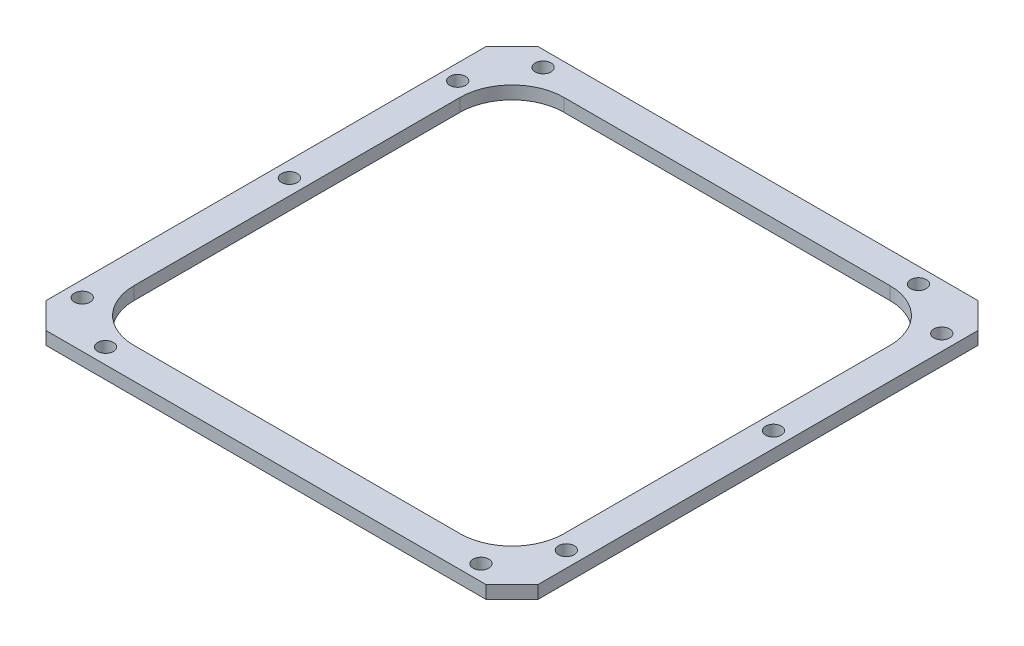
ISO-10303-21;
HEADER;
FILE_DESCRIPTION(('STEP AP214'),'2;1');
FILE_NAME('part.step','',(''),(''),'','','');
FILE_SCHEMA(('AUTOMOTIVE_DESIGN { 1 0 10303 214 1 1 1 1 }'));
ENDSEC;
DATA;
#1=APPLICATION_CONTEXT('core data for automotive mechanical design processes');
#2=APPLICATION_PROTOCOL_DEFINITION('international standard','automotive_design',2000,#1);
#3=PRODUCT_CONTEXT('',#1,'mechanical');
#4=PRODUCT('Part','Part','',(#3));
#5=PRODUCT_RELATED_PRODUCT_CATEGORY('part','',(#4));
#6=PRODUCT_DEFINITION_FORMATION('','',#4);
#7=PRODUCT_DEFINITION_CONTEXT('part definition',#1,'design');
#8=PRODUCT_DEFINITION('design','',#6,#7);
#9=PRODUCT_DEFINITION_SHAPE('','',#8);
#10=(LENGTH_UNIT() NAMED_UNIT(*) SI_UNIT(.MILLI.,.METRE.));
#11=(NAMED_UNIT(*) PLANE_ANGLE_UNIT() SI_UNIT($,.RADIAN.));
#12=(NAMED_UNIT(*) SI_UNIT($,.STERADIAN.) SOLID_ANGLE_UNIT());
#13=UNCERTAINTY_MEASURE_WITH_UNIT(LENGTH_MEASURE(1.E-05),#10,'distance_accuracy_value','');
#14=(GEOMETRIC_REPRESENTATION_CONTEXT(3) GLOBAL_UNCERTAINTY_ASSIGNED_CONTEXT((#13)) GLOBAL_UNIT_ASSIGNED_CONTEXT((#10,
#11,#12)) REPRESENTATION_CONTEXT('',''));
#15=CARTESIAN_POINT('',(0.,0.,0.));
#16=DIRECTION('',(0.,0.,1.));
#17=DIRECTION('',(1.,0.,0.));
#18=AXIS2_PLACEMENT_3D('',#15,#16,#17);
#19=CARTESIAN_POINT('',(-95.,5.,-95.));
#20=DIRECTION('',(0.,0.,-1.));
#21=DIRECTION('',(-1.,0.,0.));
#22=AXIS2_PLACEMENT_3D('',#19,#20,#21);
#23=PLANE('',#22);
#24=DIRECTION('',(1.,0.,0.));
#25=VECTOR('',#24,1.);
#26=CARTESIAN_POINT('',(-95.,5.,-95.));
#27=LINE('',#26,#25);
#28=CARTESIAN_POINT('',(-85.,5.,-95.));
#29=VERTEX_POINT('',#28);
#30=CARTESIAN_POINT('',(85.,5.,-95.));
#31=VERTEX_POINT('',#30);
#32=EDGE_CURVE('E190',#29,#31,#27,.T.);
#33=ORIENTED_EDGE('',*,*,#32,.T.);
#34=DIRECTION('',(0.,-1.,0.));
#35=VECTOR('',#34,1.);
#36=CARTESIAN_POINT('',(85.,5.,-95.));
#37=LINE('',#36,#35);
#38=CARTESIAN_POINT('',(85.,0.,-95.));
#39=VERTEX_POINT('',#38);
#40=EDGE_CURVE('E246',#31,#39,#37,.T.);
#41=ORIENTED_EDGE('',*,*,#40,.T.);
#42=DIRECTION('',(1.,0.,0.));
#43=VECTOR('',#42,1.);
#44=CARTESIAN_POINT('',(-95.,0.,-95.));
#45=LINE('',#44,#43);
#46=CARTESIAN_POINT('',(-85.,0.,-95.));
#47=VERTEX_POINT('',#46);
#48=EDGE_CURVE('E201',#47,#39,#45,.T.);
#49=ORIENTED_EDGE('',*,*,#48,.F.);
#50=DIRECTION('',(0.,1.,0.));
#51=VECTOR('',#50,1.);
#52=CARTESIAN_POINT('',(-85.,5.,-95.));
#53=LINE('',#52,#51);
#54=EDGE_CURVE('E236',#47,#29,#53,.T.);
#55=ORIENTED_EDGE('',*,*,#54,.T.);
#56=EDGE_LOOP('',(#33,#41,#49,#55));
#57=FACE_BOUND('',#56,.T.);
#58=ADVANCED_FACE('F32',(#57),#23,.T.);
#59=CARTESIAN_POINT('',(-95.,5.,-95.));
#60=DIRECTION('',(1.,0.,0.));
#61=DIRECTION('',(0.,0.,-1.));
#62=AXIS2_PLACEMENT_3D('',#59,#60,#61);
#63=PLANE('',#62);
#64=DIRECTION('',(0.,0.,1.));
#65=VECTOR('',#64,1.);
#66=CARTESIAN_POINT('',(-95.,5.,-95.));
#67=LINE('',#66,#65);
#68=CARTESIAN_POINT('',(-95.,5.,-85.));
#69=VERTEX_POINT('',#68);
#70=CARTESIAN_POINT('',(-95.,5.,85.));
#71=VERTEX_POINT('',#70);
#72=EDGE_CURVE('E199',#69,#71,#67,.T.);
#73=ORIENTED_EDGE('',*,*,#72,.F.);
#74=DIRECTION('',(0.,-1.,0.));
#75=VECTOR('',#74,1.);
#76=CARTESIAN_POINT('',(-95.,0.,-85.));
#77=LINE('',#76,#75);
#78=CARTESIAN_POINT('',(-95.,0.,-85.));
#79=VERTEX_POINT('',#78);
#80=EDGE_CURVE('E271',#69,#79,#77,.T.);
#81=ORIENTED_EDGE('',*,*,#80,.T.);
#82=DIRECTION('',(0.,0.,1.));
#83=VECTOR('',#82,1.);
#84=CARTESIAN_POINT('',(-95.,0.,-95.));
#85=LINE('',#84,#83);
#86=CARTESIAN_POINT('',(-95.,0.,85.));
#87=VERTEX_POINT('',#86);
#88=EDGE_CURVE('E194',#79,#87,#85,.T.);
#89=ORIENTED_EDGE('',*,*,#88,.T.);
#90=DIRECTION('',(0.,1.,0.));
#91=VECTOR('',#90,1.);
#92=CARTESIAN_POINT('',(-95.,5.,85.));
#93=LINE('',#92,#91);
#94=EDGE_CURVE('E269',#87,#71,#93,.T.);
#95=ORIENTED_EDGE('',*,*,#94,.T.);
#96=EDGE_LOOP('',(#73,#81,#89,#95));
#97=FACE_BOUND('',#96,.T.);
#98=ADVANCED_FACE('F277',(#97),#63,.F.);
#99=CARTESIAN_POINT('',(-95.,5.,95.));
#100=DIRECTION('',(0.,0.,-1.));
#101=DIRECTION('',(-1.,0.,0.));
#102=AXIS2_PLACEMENT_3D('',#99,#100,#101);
#103=PLANE('',#102);
#104=DIRECTION('',(1.,0.,0.));
#105=VECTOR('',#104,1.);
#106=CARTESIAN_POINT('',(-95.,5.,95.));
#107=LINE('',#106,#105);
#108=CARTESIAN_POINT('',(-85.,5.,95.));
#109=VERTEX_POINT('',#108);
#110=CARTESIAN_POINT('',(85.,5.,95.));
#111=VERTEX_POINT('',#110);
#112=EDGE_CURVE('E197',#109,#111,#107,.T.);
#113=ORIENTED_EDGE('',*,*,#112,.F.);
#114=DIRECTION('',(0.,-1.,0.));
#115=VECTOR('',#114,1.);
#116=CARTESIAN_POINT('',(-85.,5.,95.));
#117=LINE('',#116,#115);
#118=CARTESIAN_POINT('',(-85.,0.,95.));
#119=VERTEX_POINT('',#118);
#120=EDGE_CURVE('E11',#109,#119,#117,.T.);
#121=ORIENTED_EDGE('',*,*,#120,.T.);
#122=DIRECTION('',(1.,0.,0.));
#123=VECTOR('',#122,1.);
#124=CARTESIAN_POINT('',(-95.,0.,95.));
#125=LINE('',#124,#123);
#126=CARTESIAN_POINT('',(85.,0.,95.));
#127=VERTEX_POINT('',#126);
#128=EDGE_CURVE('E207',#119,#127,#125,.T.);
#129=ORIENTED_EDGE('',*,*,#128,.T.);
#130=DIRECTION('',(0.,1.,0.));
#131=VECTOR('',#130,1.);
#132=CARTESIAN_POINT('',(85.,5.,95.));
#133=LINE('',#132,#131);
#134=EDGE_CURVE('E40',#127,#111,#133,.T.);
#135=ORIENTED_EDGE('',*,*,#134,.T.);
#136=EDGE_LOOP('',(#113,#121,#129,#135));
#137=FACE_BOUND('',#136,.T.);
#138=ADVANCED_FACE('F288',(#137),#103,.F.);
#139=CARTESIAN_POINT('',(95.,5.,-95.));
#140=DIRECTION('',(1.,0.,0.));
#141=DIRECTION('',(0.,0.,-1.));
#142=AXIS2_PLACEMENT_3D('',#139,#140,#141);
#143=PLANE('',#142);
#144=DIRECTION('',(0.,0.,1.));
#145=VECTOR('',#144,1.);
#146=CARTESIAN_POINT('',(95.,0.,-95.));
#147=LINE('',#146,#145);
#148=CARTESIAN_POINT('',(95.,0.,-85.));
#149=VERTEX_POINT('',#148);
#150=CARTESIAN_POINT('',(95.,0.,85.));
#151=VERTEX_POINT('',#150);
#152=EDGE_CURVE('E204',#149,#151,#147,.T.);
#153=ORIENTED_EDGE('',*,*,#152,.F.);
#154=DIRECTION('',(0.,1.,0.));
#155=VECTOR('',#154,1.);
#156=CARTESIAN_POINT('',(95.,5.,-85.));
#157=LINE('',#156,#155);
#158=CARTESIAN_POINT('',(95.,5.,-85.));
#159=VERTEX_POINT('',#158);
#160=EDGE_CURVE('E260',#149,#159,#157,.T.);
#161=ORIENTED_EDGE('',*,*,#160,.T.);
#162=DIRECTION('',(0.,0.,1.));
#163=VECTOR('',#162,1.);
#164=CARTESIAN_POINT('',(95.,5.,-95.));
#165=LINE('',#164,#163);
#166=CARTESIAN_POINT('',(95.,5.,85.));
#167=VERTEX_POINT('',#166);
#168=EDGE_CURVE('E193',#159,#167,#165,.T.);
#169=ORIENTED_EDGE('',*,*,#168,.T.);
#170=DIRECTION('',(0.,-1.,0.));
#171=VECTOR('',#170,1.);
#172=CARTESIAN_POINT('',(95.,0.,85.));
#173=LINE('',#172,#171);
#174=EDGE_CURVE('E257',#167,#151,#173,.T.);
#175=ORIENTED_EDGE('',*,*,#174,.T.);
#176=EDGE_LOOP('',(#153,#161,#169,#175));
#177=FACE_BOUND('',#176,.T.);
#178=ADVANCED_FACE('F295',(#177),#143,.T.);
#179=CARTESIAN_POINT('',(0.,5.,0.));
#180=DIRECTION('',(0.,-1.,0.));
#181=DIRECTION('',(0.,0.,-1.));
#182=AXIS2_PLACEMENT_3D('',#179,#180,#181);
#183=PLANE('',#182);
#184=CARTESIAN_POINT('',(-89.,5.,-3.));
#185=DIRECTION('',(0.,1.,0.));
#186=DIRECTION('',(0.,0.,1.));
#187=AXIS2_PLACEMENT_3D('',#184,#185,#186);
#188=CIRCLE('',#187,3.04999999999999);
#189=CARTESIAN_POINT('',(-89.,5.,0.0499999999999884));
#190=VERTEX_POINT('',#189);
#191=EDGE_CURVE('E241',#190,#190,#188,.T.);
#192=ORIENTED_EDGE('',*,*,#191,.F.);
#193=EDGE_LOOP('',(#192));
#194=FACE_BOUND('',#193,.T.);
#195=CARTESIAN_POINT('',(89.,5.,-12.));
#196=DIRECTION('',(0.,1.,0.));
#197=DIRECTION('',(0.,0.,1.));
#198=AXIS2_PLACEMENT_3D('',#195,#196,#197);
#199=CIRCLE('',#198,3.04999999999999);
#200=CARTESIAN_POINT('',(89.,5.,-8.95000000000001));
#201=VERTEX_POINT('',#200);
#202=EDGE_CURVE('E401',#201,#201,#199,.T.);
#203=ORIENTED_EDGE('',*,*,#202,.F.);
#204=EDGE_LOOP('',(#203));
#205=FACE_BOUND('',#204,.T.);
#206=CARTESIAN_POINT('',(77.0000000000146,5.,88.9999999999822));
#207=DIRECTION('',(0.,1.,0.));
#208=DIRECTION('',(0.,0.,1.));
#209=AXIS2_PLACEMENT_3D('',#206,#207,#208);
#210=CIRCLE('',#209,3.04999999999999);
#211=CARTESIAN_POINT('',(77.0000000000146,5.,92.0499999999822));
#212=VERTEX_POINT('',#211);
#213=EDGE_CURVE('E373',#212,#212,#210,.T.);
#214=ORIENTED_EDGE('',*,*,#213,.F.);
#215=EDGE_LOOP('',(#214));
#216=FACE_BOUND('',#215,.T.);
#217=CARTESIAN_POINT('',(67.9999999999984,5.,-89.0000000000162));
#218=DIRECTION('',(0.,1.,0.));
#219=DIRECTION('',(0.,0.,1.));
#220=AXIS2_PLACEMENT_3D('',#217,#218,#219);
#221=CIRCLE('',#220,3.04999999999999);
#222=CARTESIAN_POINT('',(67.9999999999984,5.,-85.9500000000162));
#223=VERTEX_POINT('',#222);
#224=EDGE_CURVE('E380',#223,#223,#221,.T.);
#225=ORIENTED_EDGE('',*,*,#224,.F.);
#226=EDGE_LOOP('',(#225));
#227=FACE_BOUND('',#226,.T.);
#228=CARTESIAN_POINT('',(88.9999999999984,5.,-77.0000000000162));
#229=DIRECTION('',(0.,1.,0.));
#230=DIRECTION('',(0.,0.,1.));
#231=AXIS2_PLACEMENT_3D('',#228,#229,#230);
#232=CIRCLE('',#231,3.04999999999999);
#233=CARTESIAN_POINT('',(88.9999999999984,5.,-73.9500000000162));
#234=VERTEX_POINT('',#233);
#235=EDGE_CURVE('E361',#234,#234,#232,.T.);
#236=ORIENTED_EDGE('',*,*,#235,.F.);
#237=EDGE_LOOP('',(#236));
#238=FACE_BOUND('',#237,.T.);
#239=CARTESIAN_POINT('',(-89.,5.,-68.));
#240=DIRECTION('',(0.,1.,0.));
#241=DIRECTION('',(0.,0.,1.));
#242=AXIS2_PLACEMENT_3D('',#239,#240,#241);
#243=CIRCLE('',#242,3.04999999999999);
#244=CARTESIAN_POINT('',(-89.,5.,-64.95));
#245=VERTEX_POINT('',#244);
#246=EDGE_CURVE('E368',#245,#245,#243,.T.);
#247=ORIENTED_EDGE('',*,*,#246,.F.);
#248=EDGE_LOOP('',(#247));
#249=FACE_BOUND('',#248,.T.);
#250=CARTESIAN_POINT('',(89.0000000000146,5.,67.9999999999822));
#251=DIRECTION('',(0.,1.,0.));
#252=DIRECTION('',(0.,0.,1.));
#253=AXIS2_PLACEMENT_3D('',#250,#251,#252);
#254=CIRCLE('',#253,3.04999999999999);
#255=CARTESIAN_POINT('',(89.0000000000146,5.,71.0499999999822));
#256=VERTEX_POINT('',#255);
#257=EDGE_CURVE('E396',#256,#256,#254,.T.);
#258=ORIENTED_EDGE('',*,*,#257,.F.);
#259=EDGE_LOOP('',(#258));
#260=FACE_BOUND('',#259,.T.);
#261=CARTESIAN_POINT('',(-88.9999999999838,5.,76.9999999999984));
#262=DIRECTION('',(0.,1.,0.));
#263=DIRECTION('',(0.,0.,1.));
#264=AXIS2_PLACEMENT_3D('',#261,#262,#263);
#265=CIRCLE('',#264,3.04999999999999);
#266=CARTESIAN_POINT('',(-88.9999999999838,5.,80.0499999999984));
#267=VERTEX_POINT('',#266);
#268=EDGE_CURVE('E390',#267,#267,#265,.T.);
#269=ORIENTED_EDGE('',*,*,#268,.F.);
#270=EDGE_LOOP('',(#269));
#271=FACE_BOUND('',#270,.T.);
#272=CARTESIAN_POINT('',(-67.9999999999838,5.,88.9999999999984));
#273=DIRECTION('',(0.,1.,0.));
#274=DIRECTION('',(0.,0.,1.));
#275=AXIS2_PLACEMENT_3D('',#272,#273,#274);
#276=CIRCLE('',#275,3.04999999999999);
#277=CARTESIAN_POINT('',(-67.9999999999838,5.,92.0499999999984));
#278=VERTEX_POINT('',#277);
#279=EDGE_CURVE('E244',#278,#278,#276,.T.);
#280=ORIENTED_EDGE('',*,*,#279,.F.);
#281=EDGE_LOOP('',(#280));
#282=FACE_BOUND('',#281,.T.);
#283=CARTESIAN_POINT('',(-77.,5.,-89.));
#284=DIRECTION('',(0.,1.,0.));
#285=DIRECTION('',(0.,0.,1.));
#286=AXIS2_PLACEMENT_3D('',#283,#284,#285);
#287=CIRCLE('',#286,3.04999999999999);
#288=CARTESIAN_POINT('',(-77.,5.,-85.95));
#289=VERTEX_POINT('',#288);
#290=EDGE_CURVE('E180',#289,#289,#287,.T.);
#291=ORIENTED_EDGE('',*,*,#290,.F.);
#292=EDGE_LOOP('',(#291));
#293=FACE_BOUND('',#292,.T.);
#294=DIRECTION('',(-1.,0.,0.));
#295=VECTOR('',#294,1.);
#296=CARTESIAN_POINT('',(-83.,5.,-83.));
#297=LINE('',#296,#295);
#298=CARTESIAN_POINT('',(62.9999999999999,5.,-83.));
#299=VERTEX_POINT('',#298);
#300=CARTESIAN_POINT('',(-63.,5.,-83.));
#301=VERTEX_POINT('',#300);
#302=EDGE_CURVE('E173',#299,#301,#297,.T.);
#303=ORIENTED_EDGE('',*,*,#302,.F.);
#304=CARTESIAN_POINT('',(63.,5.,-63.));
#305=DIRECTION('',(0.,-1.,0.));
#306=DIRECTION('',(0.,0.,-1.));
#307=AXIS2_PLACEMENT_3D('',#304,#305,#306);
#308=CIRCLE('',#307,20.);
#309=CARTESIAN_POINT('',(83.,5.,-63.));
#310=VERTEX_POINT('',#309);
#311=EDGE_CURVE('E172',#299,#310,#308,.T.);
#312=ORIENTED_EDGE('',*,*,#311,.T.);
#313=DIRECTION('',(0.,0.,-1.));
#314=VECTOR('',#313,1.);
#315=CARTESIAN_POINT('',(83.,5.,-83.));
#316=LINE('',#315,#314);
#317=CARTESIAN_POINT('',(83.,5.,63.));
#318=VERTEX_POINT('',#317);
#319=EDGE_CURVE('E163',#318,#310,#316,.T.);
#320=ORIENTED_EDGE('',*,*,#319,.F.);
#321=CARTESIAN_POINT('',(63.,5.,63.));
#322=DIRECTION('',(0.,-1.,0.));
#323=DIRECTION('',(0.,0.,-1.));
#324=AXIS2_PLACEMENT_3D('',#321,#322,#323);
#325=CIRCLE('',#324,20.);
#326=CARTESIAN_POINT('',(62.9999999999999,5.,83.));
#327=VERTEX_POINT('',#326);
#328=EDGE_CURVE('E146',#318,#327,#325,.T.);
#329=ORIENTED_EDGE('',*,*,#328,.T.);
#330=DIRECTION('',(1.,0.,0.));
#331=VECTOR('',#330,1.);
#332=CARTESIAN_POINT('',(-83.,5.,83.));
#333=LINE('',#332,#331);
#334=CARTESIAN_POINT('',(-63.,5.,83.));
#335=VERTEX_POINT('',#334);
#336=EDGE_CURVE('E188',#335,#327,#333,.T.);
#337=ORIENTED_EDGE('',*,*,#336,.F.);
#338=CARTESIAN_POINT('',(-63.,5.,63.));
#339=DIRECTION('',(0.,-1.,0.));
#340=DIRECTION('',(0.,0.,-1.));
#341=AXIS2_PLACEMENT_3D('',#338,#339,#340);
#342=CIRCLE('',#341,20.);
#343=CARTESIAN_POINT('',(-83.,5.,63.));
#344=VERTEX_POINT('',#343);
#345=EDGE_CURVE('E225',#335,#344,#342,.T.);
#346=ORIENTED_EDGE('',*,*,#345,.T.);
#347=DIRECTION('',(0.,0.,1.));
#348=VECTOR('',#347,1.);
#349=CARTESIAN_POINT('',(-83.,5.,-83.));
#350=LINE('',#349,#348);
#351=CARTESIAN_POINT('',(-83.,5.,-63.));
#352=VERTEX_POINT('',#351);
#353=EDGE_CURVE('E177',#352,#344,#350,.T.);
#354=ORIENTED_EDGE('',*,*,#353,.F.);
#355=CARTESIAN_POINT('',(-63.,5.,-63.));
#356=DIRECTION('',(0.,-1.,0.));
#357=DIRECTION('',(0.,0.,-1.));
#358=AXIS2_PLACEMENT_3D('',#355,#356,#357);
#359=CIRCLE('',#358,20.);
#360=EDGE_CURVE('E229',#352,#301,#359,.T.);
#361=ORIENTED_EDGE('',*,*,#360,.T.);
#362=EDGE_LOOP('',(#303,#312,#320,#329,#337,#346,#354,#361));
#363=FACE_BOUND('',#362,.T.);
#364=ORIENTED_EDGE('',*,*,#168,.F.);
#365=DIRECTION('',(0.707106781186548,0.,0.707106781186548));
#366=VECTOR('',#365,1.);
#367=CARTESIAN_POINT('',(85.,5.,-95.));
#368=LINE('',#367,#366);
#369=EDGE_CURVE('E267',#159,#31,#368,.F.);
#370=ORIENTED_EDGE('',*,*,#369,.T.);
#371=ORIENTED_EDGE('',*,*,#32,.F.);
#372=DIRECTION('',(-0.70710678118655,0.,0.707106781186546));
#373=VECTOR('',#372,1.);
#374=CARTESIAN_POINT('',(-95.,5.,-85.));
#375=LINE('',#374,#373);
#376=EDGE_CURVE('E265',#29,#69,#375,.T.);
#377=ORIENTED_EDGE('',*,*,#376,.T.);
#378=ORIENTED_EDGE('',*,*,#72,.T.);
#379=DIRECTION('',(-0.707106781186548,0.,-0.707106781186548));
#380=VECTOR('',#379,1.);
#381=CARTESIAN_POINT('',(-85.,5.,95.));
#382=LINE('',#381,#380);
#383=EDGE_CURVE('E53',#71,#109,#382,.F.);
#384=ORIENTED_EDGE('',*,*,#383,.T.);
#385=ORIENTED_EDGE('',*,*,#112,.T.);
#386=DIRECTION('',(0.70710678118655,0.,-0.707106781186545));
#387=VECTOR('',#386,1.);
#388=CARTESIAN_POINT('',(95.,5.,85.));
#389=LINE('',#388,#387);
#390=EDGE_CURVE('E262',#111,#167,#389,.T.);
#391=ORIENTED_EDGE('',*,*,#390,.T.);
#392=EDGE_LOOP('',(#364,#370,#371,#377,#378,#384,#385,#391));
#393=FACE_BOUND('',#392,.T.);
#394=ADVANCED_FACE('F171',(#194,#205,#216,#227,#238,#249,#260,#271,#282,#293,#363,#393),#183,.F.);
#395=CARTESIAN_POINT('',(0.,0.,0.));
#396=DIRECTION('',(0.,-1.,0.));
#397=DIRECTION('',(0.,0.,-1.));
#398=AXIS2_PLACEMENT_3D('',#395,#396,#397);
#399=PLANE('',#398);
#400=CARTESIAN_POINT('',(-89.,0.,-3.));
#401=DIRECTION('',(0.,-1.,0.));
#402=DIRECTION('',(0.,0.,-1.));
#403=AXIS2_PLACEMENT_3D('',#400,#401,#402);
#404=CIRCLE('',#403,3.04999999999999);
#405=CARTESIAN_POINT('',(-89.,0.,-6.04999999999999));
#406=VERTEX_POINT('',#405);
#407=EDGE_CURVE('E240',#406,#406,#404,.T.);
#408=ORIENTED_EDGE('',*,*,#407,.F.);
#409=EDGE_LOOP('',(#408));
#410=FACE_BOUND('',#409,.T.);
#411=CARTESIAN_POINT('',(89.,0.,-12.));
#412=DIRECTION('',(0.,-1.,0.));
#413=DIRECTION('',(0.,0.,-1.));
#414=AXIS2_PLACEMENT_3D('',#411,#412,#413);
#415=CIRCLE('',#414,3.04999999999999);
#416=CARTESIAN_POINT('',(89.,0.,-15.05));
#417=VERTEX_POINT('',#416);
#418=EDGE_CURVE('E237',#417,#417,#415,.T.);
#419=ORIENTED_EDGE('',*,*,#418,.F.);
#420=EDGE_LOOP('',(#419));
#421=FACE_BOUND('',#420,.T.);
#422=CARTESIAN_POINT('',(77.0000000000146,0.,88.9999999999822));
#423=DIRECTION('',(0.,1.,0.));
#424=DIRECTION('',(0.,0.,1.));
#425=AXIS2_PLACEMENT_3D('',#422,#423,#424);
#426=CIRCLE('',#425,3.04999999999999);
#427=CARTESIAN_POINT('',(77.0000000000146,0.,92.0499999999822));
#428=VERTEX_POINT('',#427);
#429=EDGE_CURVE('E376',#428,#428,#426,.T.);
#430=ORIENTED_EDGE('',*,*,#429,.T.);
#431=EDGE_LOOP('',(#430));
#432=FACE_BOUND('',#431,.T.);
#433=CARTESIAN_POINT('',(67.9999999999984,0.,-89.0000000000162));
#434=DIRECTION('',(0.,1.,0.));
#435=DIRECTION('',(0.,0.,1.));
#436=AXIS2_PLACEMENT_3D('',#433,#434,#435);
#437=CIRCLE('',#436,3.04999999999999);
#438=CARTESIAN_POINT('',(67.9999999999984,0.,-85.9500000000162));
#439=VERTEX_POINT('',#438);
#440=EDGE_CURVE('E365',#439,#439,#437,.T.);
#441=ORIENTED_EDGE('',*,*,#440,.T.);
#442=EDGE_LOOP('',(#441));
#443=FACE_BOUND('',#442,.T.);
#444=CARTESIAN_POINT('',(88.9999999999984,0.,-77.0000000000162));
#445=DIRECTION('',(0.,1.,0.));
#446=DIRECTION('',(0.,0.,1.));
#447=AXIS2_PLACEMENT_3D('',#444,#445,#446);
#448=CIRCLE('',#447,3.04999999999999);
#449=CARTESIAN_POINT('',(88.9999999999984,0.,-73.9500000000162));
#450=VERTEX_POINT('',#449);
#451=EDGE_CURVE('E364',#450,#450,#448,.T.);
#452=ORIENTED_EDGE('',*,*,#451,.T.);
#453=EDGE_LOOP('',(#452));
#454=FACE_BOUND('',#453,.T.);
#455=CARTESIAN_POINT('',(-89.,0.,-68.));
#456=DIRECTION('',(0.,1.,0.));
#457=DIRECTION('',(0.,0.,1.));
#458=AXIS2_PLACEMENT_3D('',#455,#456,#457);
#459=CIRCLE('',#458,3.04999999999999);
#460=CARTESIAN_POINT('',(-89.,0.,-64.95));
#461=VERTEX_POINT('',#460);
#462=EDGE_CURVE('E359',#461,#461,#459,.T.);
#463=ORIENTED_EDGE('',*,*,#462,.T.);
#464=EDGE_LOOP('',(#463));
#465=FACE_BOUND('',#464,.T.);
#466=CARTESIAN_POINT('',(89.0000000000146,0.,67.9999999999822));
#467=DIRECTION('',(0.,1.,0.));
#468=DIRECTION('',(0.,0.,1.));
#469=AXIS2_PLACEMENT_3D('',#466,#467,#468);
#470=CIRCLE('',#469,3.04999999999999);
#471=CARTESIAN_POINT('',(89.0000000000146,0.,71.0499999999822));
#472=VERTEX_POINT('',#471);
#473=EDGE_CURVE('E377',#472,#472,#470,.T.);
#474=ORIENTED_EDGE('',*,*,#473,.T.);
#475=EDGE_LOOP('',(#474));
#476=FACE_BOUND('',#475,.T.);
#477=CARTESIAN_POINT('',(-88.9999999999838,0.,76.9999999999984));
#478=DIRECTION('',(0.,1.,0.));
#479=DIRECTION('',(0.,0.,1.));
#480=AXIS2_PLACEMENT_3D('',#477,#478,#479);
#481=CIRCLE('',#480,3.04999999999999);
#482=CARTESIAN_POINT('',(-88.9999999999838,0.,80.0499999999984));
#483=VERTEX_POINT('',#482);
#484=EDGE_CURVE('E393',#483,#483,#481,.T.);
#485=ORIENTED_EDGE('',*,*,#484,.T.);
#486=EDGE_LOOP('',(#485));
#487=FACE_BOUND('',#486,.T.);
#488=CARTESIAN_POINT('',(-67.9999999999838,0.,88.9999999999984));
#489=DIRECTION('',(0.,1.,0.));
#490=DIRECTION('',(0.,0.,1.));
#491=AXIS2_PLACEMENT_3D('',#488,#489,#490);
#492=CIRCLE('',#491,3.04999999999999);
#493=CARTESIAN_POINT('',(-67.9999999999838,0.,92.0499999999984));
#494=VERTEX_POINT('',#493);
#495=EDGE_CURVE('E387',#494,#494,#492,.T.);
#496=ORIENTED_EDGE('',*,*,#495,.T.);
#497=EDGE_LOOP('',(#496));
#498=FACE_BOUND('',#497,.T.);
#499=CARTESIAN_POINT('',(-77.,0.,-89.));
#500=DIRECTION('',(0.,1.,0.));
#501=DIRECTION('',(0.,0.,1.));
#502=AXIS2_PLACEMENT_3D('',#499,#500,#501);
#503=CIRCLE('',#502,3.04999999999999);
#504=CARTESIAN_POINT('',(-77.,0.,-85.95));
#505=VERTEX_POINT('',#504);
#506=EDGE_CURVE('E174',#505,#505,#503,.T.);
#507=ORIENTED_EDGE('',*,*,#506,.T.);
#508=EDGE_LOOP('',(#507));
#509=FACE_BOUND('',#508,.T.);
#510=DIRECTION('',(1.,0.,0.));
#511=VECTOR('',#510,1.);
#512=CARTESIAN_POINT('',(-83.,0.,83.));
#513=LINE('',#512,#511);
#514=CARTESIAN_POINT('',(-63.,0.,83.));
#515=VERTEX_POINT('',#514);
#516=CARTESIAN_POINT('',(62.9999999999999,0.,83.));
#517=VERTEX_POINT('',#516);
#518=EDGE_CURVE('E183',#515,#517,#513,.T.);
#519=ORIENTED_EDGE('',*,*,#518,.T.);
#520=CARTESIAN_POINT('',(63.,0.,63.));
#521=DIRECTION('',(0.,-1.,0.));
#522=DIRECTION('',(0.,0.,-1.));
#523=AXIS2_PLACEMENT_3D('',#520,#521,#522);
#524=CIRCLE('',#523,20.);
#525=CARTESIAN_POINT('',(83.,0.,63.));
#526=VERTEX_POINT('',#525);
#527=EDGE_CURVE('E156',#517,#526,#524,.F.);
#528=ORIENTED_EDGE('',*,*,#527,.T.);
#529=DIRECTION('',(0.,0.,-1.));
#530=VECTOR('',#529,1.);
#531=CARTESIAN_POINT('',(83.,0.,-83.));
#532=LINE('',#531,#530);
#533=CARTESIAN_POINT('',(83.,0.,-63.));
#534=VERTEX_POINT('',#533);
#535=EDGE_CURVE('E166',#526,#534,#532,.T.);
#536=ORIENTED_EDGE('',*,*,#535,.T.);
#537=CARTESIAN_POINT('',(63.,0.,-63.));
#538=DIRECTION('',(0.,-1.,0.));
#539=DIRECTION('',(0.,0.,-1.));
#540=AXIS2_PLACEMENT_3D('',#537,#538,#539);
#541=CIRCLE('',#540,20.);
#542=CARTESIAN_POINT('',(62.9999999999999,0.,-83.));
#543=VERTEX_POINT('',#542);
#544=EDGE_CURVE('E234',#534,#543,#541,.F.);
#545=ORIENTED_EDGE('',*,*,#544,.T.);
#546=DIRECTION('',(-1.,0.,0.));
#547=VECTOR('',#546,1.);
#548=CARTESIAN_POINT('',(-83.,0.,-83.));
#549=LINE('',#548,#547);
#550=CARTESIAN_POINT('',(-63.,0.,-83.));
#551=VERTEX_POINT('',#550);
#552=EDGE_CURVE('E349',#543,#551,#549,.T.);
#553=ORIENTED_EDGE('',*,*,#552,.T.);
#554=CARTESIAN_POINT('',(-63.,0.,-63.));
#555=DIRECTION('',(0.,-1.,0.));
#556=DIRECTION('',(0.,0.,-1.));
#557=AXIS2_PLACEMENT_3D('',#554,#555,#556);
#558=CIRCLE('',#557,20.);
#559=CARTESIAN_POINT('',(-83.,0.,-63.));
#560=VERTEX_POINT('',#559);
#561=EDGE_CURVE('E231',#551,#560,#558,.F.);
#562=ORIENTED_EDGE('',*,*,#561,.T.);
#563=DIRECTION('',(0.,0.,1.));
#564=VECTOR('',#563,1.);
#565=CARTESIAN_POINT('',(-83.,0.,-83.));
#566=LINE('',#565,#564);
#567=CARTESIAN_POINT('',(-83.,0.,63.));
#568=VERTEX_POINT('',#567);
#569=EDGE_CURVE('E353',#560,#568,#566,.T.);
#570=ORIENTED_EDGE('',*,*,#569,.T.);
#571=CARTESIAN_POINT('',(-63.,0.,63.));
#572=DIRECTION('',(0.,-1.,0.));
#573=DIRECTION('',(0.,0.,-1.));
#574=AXIS2_PLACEMENT_3D('',#571,#572,#573);
#575=CIRCLE('',#574,20.);
#576=EDGE_CURVE('E227',#568,#515,#575,.F.);
#577=ORIENTED_EDGE('',*,*,#576,.T.);
#578=EDGE_LOOP('',(#519,#528,#536,#545,#553,#562,#570,#577));
#579=FACE_BOUND('',#578,.T.);
#580=ORIENTED_EDGE('',*,*,#48,.T.);
#581=DIRECTION('',(-0.707106781186548,0.,-0.707106781186548));
#582=VECTOR('',#581,1.);
#583=CARTESIAN_POINT('',(90.,0.,-90.));
#584=LINE('',#583,#582);
#585=EDGE_CURVE('E255',#39,#149,#584,.F.);
#586=ORIENTED_EDGE('',*,*,#585,.T.);
#587=ORIENTED_EDGE('',*,*,#152,.T.);
#588=DIRECTION('',(-0.70710678118655,0.,0.707106781186545));
#589=VECTOR('',#588,1.);
#590=CARTESIAN_POINT('',(89.9999999999997,0.,90.0000000000003));
#591=LINE('',#590,#589);
#592=EDGE_CURVE('E249',#151,#127,#591,.T.);
#593=ORIENTED_EDGE('',*,*,#592,.T.);
#594=ORIENTED_EDGE('',*,*,#128,.F.);
#595=DIRECTION('',(0.707106781186548,0.,0.707106781186548));
#596=VECTOR('',#595,1.);
#597=CARTESIAN_POINT('',(-90.,0.,90.));
#598=LINE('',#597,#596);
#599=EDGE_CURVE('E251',#119,#87,#598,.F.);
#600=ORIENTED_EDGE('',*,*,#599,.T.);
#601=ORIENTED_EDGE('',*,*,#88,.F.);
#602=DIRECTION('',(0.70710678118655,0.,-0.707106781186546));
#603=VECTOR('',#602,1.);
#604=CARTESIAN_POINT('',(-89.9999999999997,0.,-90.0000000000003));
#605=LINE('',#604,#603);
#606=EDGE_CURVE('E253',#79,#47,#605,.T.);
#607=ORIENTED_EDGE('',*,*,#606,.T.);
#608=EDGE_LOOP('',(#580,#586,#587,#593,#594,#600,#601,#607));
#609=FACE_BOUND('',#608,.T.);
#610=ADVANCED_FACE('F282',(#410,#421,#432,#443,#454,#465,#476,#487,#498,#509,#579,#609),#399,.T.);
#611=CARTESIAN_POINT('',(83.,0.,-83.));
#612=DIRECTION('',(1.,0.,0.));
#613=DIRECTION('',(0.,0.,-1.));
#614=AXIS2_PLACEMENT_3D('',#611,#612,#613);
#615=PLANE('',#614);
#616=ORIENTED_EDGE('',*,*,#535,.F.);
#617=DIRECTION('',(0.,1.,0.));
#618=VECTOR('',#617,1.);
#619=CARTESIAN_POINT('',(83.,5.,63.));
#620=LINE('',#619,#618);
#621=EDGE_CURVE('E150',#526,#318,#620,.T.);
#622=ORIENTED_EDGE('',*,*,#621,.T.);
#623=ORIENTED_EDGE('',*,*,#319,.T.);
#624=DIRECTION('',(0.,1.,0.));
#625=VECTOR('',#624,1.);
#626=CARTESIAN_POINT('',(83.,0.,-63.));
#627=LINE('',#626,#625);
#628=EDGE_CURVE('E168',#310,#534,#627,.F.);
#629=ORIENTED_EDGE('',*,*,#628,.T.);
#630=EDGE_LOOP('',(#616,#622,#623,#629));
#631=FACE_BOUND('',#630,.T.);
#632=ADVANCED_FACE('F162',(#631),#615,.F.);
#633=CARTESIAN_POINT('',(-83.,0.,83.));
#634=DIRECTION('',(0.,0.,1.));
#635=DIRECTION('',(1.,0.,0.));
#636=AXIS2_PLACEMENT_3D('',#633,#634,#635);
#637=PLANE('',#636);
#638=ORIENTED_EDGE('',*,*,#336,.T.);
#639=DIRECTION('',(0.,1.,0.));
#640=VECTOR('',#639,1.);
#641=CARTESIAN_POINT('',(63.,0.,83.));
#642=LINE('',#641,#640);
#643=EDGE_CURVE('E151',#327,#517,#642,.F.);
#644=ORIENTED_EDGE('',*,*,#643,.T.);
#645=ORIENTED_EDGE('',*,*,#518,.F.);
#646=DIRECTION('',(0.,1.,0.));
#647=VECTOR('',#646,1.);
#648=CARTESIAN_POINT('',(-63.,5.,83.));
#649=LINE('',#648,#647);
#650=EDGE_CURVE('E167',#515,#335,#649,.T.);
#651=ORIENTED_EDGE('',*,*,#650,.T.);
#652=EDGE_LOOP('',(#638,#644,#645,#651));
#653=FACE_BOUND('',#652,.T.);
#654=ADVANCED_FACE('F460',(#653),#637,.F.);
#655=CARTESIAN_POINT('',(-83.,0.,-83.));
#656=DIRECTION('',(-1.,0.,0.));
#657=DIRECTION('',(0.,0.,1.));
#658=AXIS2_PLACEMENT_3D('',#655,#656,#657);
#659=PLANE('',#658);
#660=ORIENTED_EDGE('',*,*,#353,.T.);
#661=DIRECTION('',(0.,1.,0.));
#662=VECTOR('',#661,1.);
#663=CARTESIAN_POINT('',(-83.,0.,63.));
#664=LINE('',#663,#662);
#665=EDGE_CURVE('E218',#344,#568,#664,.F.);
#666=ORIENTED_EDGE('',*,*,#665,.T.);
#667=ORIENTED_EDGE('',*,*,#569,.F.);
#668=DIRECTION('',(0.,1.,0.));
#669=VECTOR('',#668,1.);
#670=CARTESIAN_POINT('',(-83.,5.,-63.));
#671=LINE('',#670,#669);
#672=EDGE_CURVE('E215',#560,#352,#671,.T.);
#673=ORIENTED_EDGE('',*,*,#672,.T.);
#674=EDGE_LOOP('',(#660,#666,#667,#673));
#675=FACE_BOUND('',#674,.T.);
#676=ADVANCED_FACE('F463',(#675),#659,.F.);
#677=CARTESIAN_POINT('',(-83.,0.,-83.));
#678=DIRECTION('',(0.,0.,-1.));
#679=DIRECTION('',(-1.,0.,0.));
#680=AXIS2_PLACEMENT_3D('',#677,#678,#679);
#681=PLANE('',#680);
#682=ORIENTED_EDGE('',*,*,#302,.T.);
#683=DIRECTION('',(0.,1.,0.));
#684=VECTOR('',#683,1.);
#685=CARTESIAN_POINT('',(-63.,0.,-83.));
#686=LINE('',#685,#684);
#687=EDGE_CURVE('E157',#301,#551,#686,.F.);
#688=ORIENTED_EDGE('',*,*,#687,.T.);
#689=ORIENTED_EDGE('',*,*,#552,.F.);
#690=DIRECTION('',(0.,1.,0.));
#691=VECTOR('',#690,1.);
#692=CARTESIAN_POINT('',(63.,5.,-83.));
#693=LINE('',#692,#691);
#694=EDGE_CURVE('E220',#543,#299,#693,.T.);
#695=ORIENTED_EDGE('',*,*,#694,.T.);
#696=EDGE_LOOP('',(#682,#688,#689,#695));
#697=FACE_BOUND('',#696,.T.);
#698=ADVANCED_FACE('F325',(#697),#681,.F.);
#699=CARTESIAN_POINT('',(63.,0.,63.));
#700=DIRECTION('',(0.,-1.,0.));
#701=DIRECTION('',(0.,0.,-1.));
#702=AXIS2_PLACEMENT_3D('',#699,#700,#701);
#703=CYLINDRICAL_SURFACE('',#702,20.);
#704=ORIENTED_EDGE('',*,*,#527,.F.);
#705=ORIENTED_EDGE('',*,*,#643,.F.);
#706=ORIENTED_EDGE('',*,*,#328,.F.);
#707=ORIENTED_EDGE('',*,*,#621,.F.);
#708=EDGE_LOOP('',(#704,#705,#706,#707));
#709=FACE_BOUND('',#708,.T.);
#710=ADVANCED_FACE('F149',(#709),#703,.F.);
#711=CARTESIAN_POINT('',(-63.,0.,63.));
#712=DIRECTION('',(0.,-1.,0.));
#713=DIRECTION('',(0.,0.,-1.));
#714=AXIS2_PLACEMENT_3D('',#711,#712,#713);
#715=CYLINDRICAL_SURFACE('',#714,20.);
#716=ORIENTED_EDGE('',*,*,#576,.F.);
#717=ORIENTED_EDGE('',*,*,#665,.F.);
#718=ORIENTED_EDGE('',*,*,#345,.F.);
#719=ORIENTED_EDGE('',*,*,#650,.F.);
#720=EDGE_LOOP('',(#716,#717,#718,#719));
#721=FACE_BOUND('',#720,.T.);
#722=ADVANCED_FACE('F324',(#721),#715,.F.);
#723=CARTESIAN_POINT('',(-63.,0.,-63.));
#724=DIRECTION('',(0.,-1.,0.));
#725=DIRECTION('',(0.,0.,-1.));
#726=AXIS2_PLACEMENT_3D('',#723,#724,#725);
#727=CYLINDRICAL_SURFACE('',#726,20.);
#728=ORIENTED_EDGE('',*,*,#561,.F.);
#729=ORIENTED_EDGE('',*,*,#687,.F.);
#730=ORIENTED_EDGE('',*,*,#360,.F.);
#731=ORIENTED_EDGE('',*,*,#672,.F.);
#732=EDGE_LOOP('',(#728,#729,#730,#731));
#733=FACE_BOUND('',#732,.T.);
#734=ADVANCED_FACE('F328',(#733),#727,.F.);
#735=CARTESIAN_POINT('',(63.,0.,-63.));
#736=DIRECTION('',(0.,-1.,0.));
#737=DIRECTION('',(0.,0.,-1.));
#738=AXIS2_PLACEMENT_3D('',#735,#736,#737);
#739=CYLINDRICAL_SURFACE('',#738,20.);
#740=ORIENTED_EDGE('',*,*,#544,.F.);
#741=ORIENTED_EDGE('',*,*,#628,.F.);
#742=ORIENTED_EDGE('',*,*,#311,.F.);
#743=ORIENTED_EDGE('',*,*,#694,.F.);
#744=EDGE_LOOP('',(#740,#741,#742,#743));
#745=FACE_BOUND('',#744,.T.);
#746=ADVANCED_FACE('F332',(#745),#739,.F.);
#747=CARTESIAN_POINT('',(-77.,0.,-89.));
#748=DIRECTION('',(0.,1.,0.));
#749=DIRECTION('',(0.,0.,1.));
#750=AXIS2_PLACEMENT_3D('',#747,#748,#749);
#751=CYLINDRICAL_SURFACE('',#750,3.04999999999999);
#752=ORIENTED_EDGE('',*,*,#506,.F.);
#753=EDGE_LOOP('',(#752));
#754=FACE_BOUND('',#753,.T.);
#755=ORIENTED_EDGE('',*,*,#290,.T.);
#756=EDGE_LOOP('',(#755));
#757=FACE_BOUND('',#756,.T.);
#758=ADVANCED_FACE('F335',(#754,#757),#751,.F.);
#759=CARTESIAN_POINT('',(-67.9999999999838,0.,88.9999999999984));
#760=DIRECTION('',(0.,1.,0.));
#761=DIRECTION('',(0.,0.,1.));
#762=AXIS2_PLACEMENT_3D('',#759,#760,#761);
#763=CYLINDRICAL_SURFACE('',#762,3.04999999999999);
#764=ORIENTED_EDGE('',*,*,#495,.F.);
#765=EDGE_LOOP('',(#764));
#766=FACE_BOUND('',#765,.T.);
#767=ORIENTED_EDGE('',*,*,#279,.T.);
#768=EDGE_LOOP('',(#767));
#769=FACE_BOUND('',#768,.T.);
#770=ADVANCED_FACE('F340',(#766,#769),#763,.F.);
#771=CARTESIAN_POINT('',(-88.9999999999838,0.,76.9999999999984));
#772=DIRECTION('',(0.,1.,0.));
#773=DIRECTION('',(0.,0.,1.));
#774=AXIS2_PLACEMENT_3D('',#771,#772,#773);
#775=CYLINDRICAL_SURFACE('',#774,3.04999999999999);
#776=ORIENTED_EDGE('',*,*,#484,.F.);
#777=EDGE_LOOP('',(#776));
#778=FACE_BOUND('',#777,.T.);
#779=ORIENTED_EDGE('',*,*,#268,.T.);
#780=EDGE_LOOP('',(#779));
#781=FACE_BOUND('',#780,.T.);
#782=ADVANCED_FACE('F431',(#778,#781),#775,.F.);
#783=CARTESIAN_POINT('',(89.0000000000146,0.,67.9999999999822));
#784=DIRECTION('',(0.,1.,0.));
#785=DIRECTION('',(0.,0.,1.));
#786=AXIS2_PLACEMENT_3D('',#783,#784,#785);
#787=CYLINDRICAL_SURFACE('',#786,3.04999999999999);
#788=ORIENTED_EDGE('',*,*,#473,.F.);
#789=EDGE_LOOP('',(#788));
#790=FACE_BOUND('',#789,.T.);
#791=ORIENTED_EDGE('',*,*,#257,.T.);
#792=EDGE_LOOP('',(#791));
#793=FACE_BOUND('',#792,.T.);
#794=ADVANCED_FACE('F437',(#790,#793),#787,.F.);
#795=CARTESIAN_POINT('',(-89.,0.,-68.));
#796=DIRECTION('',(0.,1.,0.));
#797=DIRECTION('',(0.,0.,1.));
#798=AXIS2_PLACEMENT_3D('',#795,#796,#797);
#799=CYLINDRICAL_SURFACE('',#798,3.04999999999999);
#800=ORIENTED_EDGE('',*,*,#462,.F.);
#801=EDGE_LOOP('',(#800));
#802=FACE_BOUND('',#801,.T.);
#803=ORIENTED_EDGE('',*,*,#246,.T.);
#804=EDGE_LOOP('',(#803));
#805=FACE_BOUND('',#804,.T.);
#806=ADVANCED_FACE('F453',(#802,#805),#799,.F.);
#807=CARTESIAN_POINT('',(88.9999999999984,0.,-77.0000000000162));
#808=DIRECTION('',(0.,1.,0.));
#809=DIRECTION('',(0.,0.,1.));
#810=AXIS2_PLACEMENT_3D('',#807,#808,#809);
#811=CYLINDRICAL_SURFACE('',#810,3.04999999999999);
#812=ORIENTED_EDGE('',*,*,#451,.F.);
#813=EDGE_LOOP('',(#812));
#814=FACE_BOUND('',#813,.T.);
#815=ORIENTED_EDGE('',*,*,#235,.T.);
#816=EDGE_LOOP('',(#815));
#817=FACE_BOUND('',#816,.T.);
#818=ADVANCED_FACE('F447',(#814,#817),#811,.F.);
#819=CARTESIAN_POINT('',(67.9999999999984,0.,-89.0000000000162));
#820=DIRECTION('',(0.,1.,0.));
#821=DIRECTION('',(0.,0.,1.));
#822=AXIS2_PLACEMENT_3D('',#819,#820,#821);
#823=CYLINDRICAL_SURFACE('',#822,3.04999999999999);
#824=ORIENTED_EDGE('',*,*,#440,.F.);
#825=EDGE_LOOP('',(#824));
#826=FACE_BOUND('',#825,.T.);
#827=ORIENTED_EDGE('',*,*,#224,.T.);
#828=EDGE_LOOP('',(#827));
#829=FACE_BOUND('',#828,.T.);
#830=ADVANCED_FACE('F443',(#826,#829),#823,.F.);
#831=CARTESIAN_POINT('',(77.0000000000146,0.,88.9999999999822));
#832=DIRECTION('',(0.,1.,0.));
#833=DIRECTION('',(0.,0.,1.));
#834=AXIS2_PLACEMENT_3D('',#831,#832,#833);
#835=CYLINDRICAL_SURFACE('',#834,3.04999999999999);
#836=ORIENTED_EDGE('',*,*,#429,.F.);
#837=EDGE_LOOP('',(#836));
#838=FACE_BOUND('',#837,.T.);
#839=ORIENTED_EDGE('',*,*,#213,.T.);
#840=EDGE_LOOP('',(#839));
#841=FACE_BOUND('',#840,.T.);
#842=ADVANCED_FACE('F446',(#838,#841),#835,.F.);
#843=CARTESIAN_POINT('',(89.,-5.,-12.));
#844=DIRECTION('',(0.,1.,0.));
#845=DIRECTION('',(0.,0.,1.));
#846=AXIS2_PLACEMENT_3D('',#843,#844,#845);
#847=CYLINDRICAL_SURFACE('',#846,3.04999999999999);
#848=ORIENTED_EDGE('',*,*,#418,.T.);
#849=EDGE_LOOP('',(#848));
#850=FACE_BOUND('',#849,.T.);
#851=ORIENTED_EDGE('',*,*,#202,.T.);
#852=EDGE_LOOP('',(#851));
#853=FACE_BOUND('',#852,.T.);
#854=ADVANCED_FACE('F451',(#850,#853),#847,.F.);
#855=CARTESIAN_POINT('',(-89.,-5.,-3.));
#856=DIRECTION('',(0.,1.,0.));
#857=DIRECTION('',(0.,0.,1.));
#858=AXIS2_PLACEMENT_3D('',#855,#856,#857);
#859=CYLINDRICAL_SURFACE('',#858,3.04999999999999);
#860=ORIENTED_EDGE('',*,*,#407,.T.);
#861=EDGE_LOOP('',(#860));
#862=FACE_BOUND('',#861,.T.);
#863=ORIENTED_EDGE('',*,*,#191,.T.);
#864=EDGE_LOOP('',(#863));
#865=FACE_BOUND('',#864,.T.);
#866=ADVANCED_FACE('F311',(#862,#865),#859,.F.);
#867=CARTESIAN_POINT('',(85.,5.,-95.));
#868=DIRECTION('',(-0.707106781186547,0.,0.707106781186547));
#869=DIRECTION('',(0.,-1.,0.));
#870=AXIS2_PLACEMENT_3D('',#867,#868,#869);
#871=PLANE('',#870);
#872=ORIENTED_EDGE('',*,*,#369,.F.);
#873=ORIENTED_EDGE('',*,*,#160,.F.);
#874=ORIENTED_EDGE('',*,*,#585,.F.);
#875=ORIENTED_EDGE('',*,*,#40,.F.);
#876=EDGE_LOOP('',(#872,#873,#874,#875));
#877=FACE_BOUND('',#876,.T.);
#878=ADVANCED_FACE('F300',(#877),#871,.F.);
#879=CARTESIAN_POINT('',(-95.,5.,-85.));
#880=DIRECTION('',(-0.707106781186545,0.,-0.707106781186549));
#881=DIRECTION('',(0.,1.,0.));
#882=AXIS2_PLACEMENT_3D('',#879,#880,#881);
#883=PLANE('',#882);
#884=ORIENTED_EDGE('',*,*,#376,.F.);
#885=ORIENTED_EDGE('',*,*,#54,.F.);
#886=ORIENTED_EDGE('',*,*,#606,.F.);
#887=ORIENTED_EDGE('',*,*,#80,.F.);
#888=EDGE_LOOP('',(#884,#885,#886,#887));
#889=FACE_BOUND('',#888,.T.);
#890=ADVANCED_FACE('F304',(#889),#883,.T.);
#891=CARTESIAN_POINT('',(-85.,5.,95.));
#892=DIRECTION('',(0.707106781186547,0.,-0.707106781186547));
#893=DIRECTION('',(0.,-1.,0.));
#894=AXIS2_PLACEMENT_3D('',#891,#892,#893);
#895=PLANE('',#894);
#896=ORIENTED_EDGE('',*,*,#383,.F.);
#897=ORIENTED_EDGE('',*,*,#94,.F.);
#898=ORIENTED_EDGE('',*,*,#599,.F.);
#899=ORIENTED_EDGE('',*,*,#120,.F.);
#900=EDGE_LOOP('',(#896,#897,#898,#899));
#901=FACE_BOUND('',#900,.T.);
#902=ADVANCED_FACE('F287',(#901),#895,.F.);
#903=CARTESIAN_POINT('',(95.,5.,85.));
#904=DIRECTION('',(0.707106781186545,0.,0.70710678118655));
#905=DIRECTION('',(0.,1.,0.));
#906=AXIS2_PLACEMENT_3D('',#903,#904,#905);
#907=PLANE('',#906);
#908=ORIENTED_EDGE('',*,*,#390,.F.);
#909=ORIENTED_EDGE('',*,*,#134,.F.);
#910=ORIENTED_EDGE('',*,*,#592,.F.);
#911=ORIENTED_EDGE('',*,*,#174,.F.);
#912=EDGE_LOOP('',(#908,#909,#910,#911));
#913=FACE_BOUND('',#912,.T.);
#914=ADVANCED_FACE('F34',(#913),#907,.T.);
#915=CLOSED_SHELL('',(#58,#98,#138,#178,#394,#610,#632,#654,#676,#698,#710,#722,#734,#746,#758,
#770,#782,#794,#806,#818,#830,#842,#854,#866,#878,#890,#902,#914));
#916=MANIFOLD_SOLID_BREP('B2',#915);
#917=ADVANCED_BREP_SHAPE_REPRESENTATION('',(#18,#916),#14);
#918=SHAPE_DEFINITION_REPRESENTATION(#9,#917);
ENDSEC;
END-ISO-10303-21;
